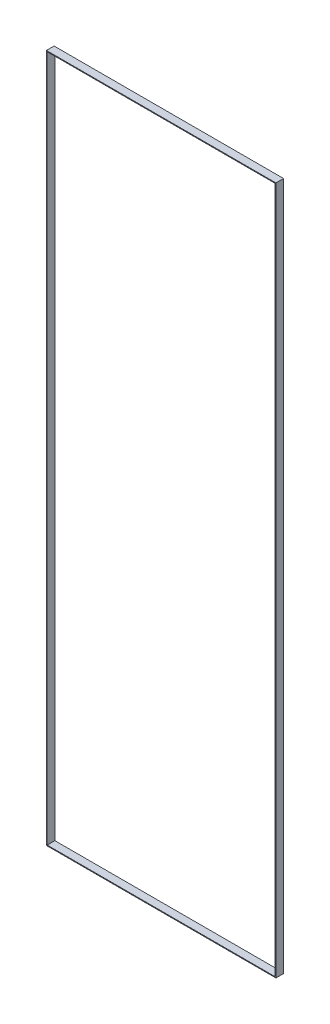
ISO-10303-21;
HEADER;
FILE_DESCRIPTION(('STEP AP214'),'2;1');
FILE_NAME('part.step','',(''),(''),'','','');
FILE_SCHEMA(('AUTOMOTIVE_DESIGN { 1 0 10303 214 1 1 1 1 }'));
ENDSEC;
DATA;
#1=APPLICATION_CONTEXT('core data for automotive mechanical design processes');
#2=APPLICATION_PROTOCOL_DEFINITION('international standard','automotive_design',2000,#1);
#3=PRODUCT_CONTEXT('',#1,'mechanical');
#4=PRODUCT('Part','Part','',(#3));
#5=PRODUCT_RELATED_PRODUCT_CATEGORY('part','',(#4));
#6=PRODUCT_DEFINITION_FORMATION('','',#4);
#7=PRODUCT_DEFINITION_CONTEXT('part definition',#1,'design');
#8=PRODUCT_DEFINITION('design','',#6,#7);
#9=PRODUCT_DEFINITION_SHAPE('','',#8);
#10=(LENGTH_UNIT() NAMED_UNIT(*) SI_UNIT(.MILLI.,.METRE.));
#11=(NAMED_UNIT(*) PLANE_ANGLE_UNIT() SI_UNIT($,.RADIAN.));
#12=(NAMED_UNIT(*) SI_UNIT($,.STERADIAN.) SOLID_ANGLE_UNIT());
#13=UNCERTAINTY_MEASURE_WITH_UNIT(LENGTH_MEASURE(1.E-05),#10,'distance_accuracy_value','');
#14=(GEOMETRIC_REPRESENTATION_CONTEXT(3) GLOBAL_UNCERTAINTY_ASSIGNED_CONTEXT((#13)) GLOBAL_UNIT_ASSIGNED_CONTEXT((#10,
#11,#12)) REPRESENTATION_CONTEXT('',''));
#15=CARTESIAN_POINT('',(0.,0.,0.));
#16=DIRECTION('',(0.,0.,1.));
#17=DIRECTION('',(1.,0.,0.));
#18=AXIS2_PLACEMENT_3D('',#15,#16,#17);
#19=CARTESIAN_POINT('',(0.,0.,20.));
#20=DIRECTION('',(0.,0.,1.));
#21=DIRECTION('',(1.,0.,0.));
#22=AXIS2_PLACEMENT_3D('',#19,#20,#21);
#23=PLANE('',#22);
#24=DIRECTION('',(0.,-1.,0.));
#25=VECTOR('',#24,1.);
#26=CARTESIAN_POINT('',(-300.,-900.,20.));
#27=LINE('',#26,#25);
#28=CARTESIAN_POINT('',(-300.,900.,20.));
#29=VERTEX_POINT('',#28);
#30=CARTESIAN_POINT('',(-300.,-900.,20.));
#31=VERTEX_POINT('',#30);
#32=EDGE_CURVE('E134',#29,#31,#27,.T.);
#33=ORIENTED_EDGE('',*,*,#32,.T.);
#34=DIRECTION('',(1.,0.,0.));
#35=VECTOR('',#34,1.);
#36=CARTESIAN_POINT('',(300.,-900.,20.));
#37=LINE('',#36,#35);
#38=CARTESIAN_POINT('',(300.,-900.,20.));
#39=VERTEX_POINT('',#38);
#40=EDGE_CURVE('E137',#31,#39,#37,.T.);
#41=ORIENTED_EDGE('',*,*,#40,.T.);
#42=DIRECTION('',(0.,1.,0.));
#43=VECTOR('',#42,1.);
#44=CARTESIAN_POINT('',(300.,-900.,20.));
#45=LINE('',#44,#43);
#46=CARTESIAN_POINT('',(300.,900.,20.));
#47=VERTEX_POINT('',#46);
#48=EDGE_CURVE('E140',#39,#47,#45,.T.);
#49=ORIENTED_EDGE('',*,*,#48,.T.);
#50=DIRECTION('',(-1.,0.,0.));
#51=VECTOR('',#50,1.);
#52=CARTESIAN_POINT('',(300.,900.,20.));
#53=LINE('',#52,#51);
#54=EDGE_CURVE('E142',#47,#29,#53,.T.);
#55=ORIENTED_EDGE('',*,*,#54,.T.);
#56=EDGE_LOOP('',(#33,#41,#49,#55));
#57=FACE_BOUND('',#56,.T.);
#58=DIRECTION('',(1.,0.,0.));
#59=VECTOR('',#58,1.);
#60=CARTESIAN_POINT('',(298.,-898.,20.));
#61=LINE('',#60,#59);
#62=CARTESIAN_POINT('',(-298.,-898.,20.));
#63=VERTEX_POINT('',#62);
#64=CARTESIAN_POINT('',(298.,-898.,20.));
#65=VERTEX_POINT('',#64);
#66=EDGE_CURVE('E106',#63,#65,#61,.T.);
#67=ORIENTED_EDGE('',*,*,#66,.F.);
#68=DIRECTION('',(0.,-1.,0.));
#69=VECTOR('',#68,1.);
#70=CARTESIAN_POINT('',(-298.,-898.,20.));
#71=LINE('',#70,#69);
#72=CARTESIAN_POINT('',(-298.,898.,20.));
#73=VERTEX_POINT('',#72);
#74=EDGE_CURVE('E98',#73,#63,#71,.T.);
#75=ORIENTED_EDGE('',*,*,#74,.F.);
#76=DIRECTION('',(-1.,0.,0.));
#77=VECTOR('',#76,1.);
#78=CARTESIAN_POINT('',(298.,898.,20.));
#79=LINE('',#78,#77);
#80=CARTESIAN_POINT('',(298.,898.,20.));
#81=VERTEX_POINT('',#80);
#82=EDGE_CURVE('E120',#81,#73,#79,.T.);
#83=ORIENTED_EDGE('',*,*,#82,.F.);
#84=DIRECTION('',(0.,1.,0.));
#85=VECTOR('',#84,1.);
#86=CARTESIAN_POINT('',(298.,-898.,20.));
#87=LINE('',#86,#85);
#88=EDGE_CURVE('E118',#65,#81,#87,.T.);
#89=ORIENTED_EDGE('',*,*,#88,.F.);
#90=EDGE_LOOP('',(#67,#75,#83,#89));
#91=FACE_BOUND('',#90,.T.);
#92=ADVANCED_FACE('F33',(#57,#91),#23,.T.);
#93=CARTESIAN_POINT('',(0.,0.,0.));
#94=DIRECTION('',(0.,0.,1.));
#95=DIRECTION('',(1.,0.,0.));
#96=AXIS2_PLACEMENT_3D('',#93,#94,#95);
#97=PLANE('',#96);
#98=DIRECTION('',(0.,-1.,0.));
#99=VECTOR('',#98,1.);
#100=CARTESIAN_POINT('',(-300.,-900.,0.));
#101=LINE('',#100,#99);
#102=CARTESIAN_POINT('',(-300.,900.,0.));
#103=VERTEX_POINT('',#102);
#104=CARTESIAN_POINT('',(-300.,-900.,0.));
#105=VERTEX_POINT('',#104);
#106=EDGE_CURVE('E114',#103,#105,#101,.T.);
#107=ORIENTED_EDGE('',*,*,#106,.F.);
#108=DIRECTION('',(-1.,0.,0.));
#109=VECTOR('',#108,1.);
#110=CARTESIAN_POINT('',(300.,900.,0.));
#111=LINE('',#110,#109);
#112=CARTESIAN_POINT('',(300.,900.,0.));
#113=VERTEX_POINT('',#112);
#114=EDGE_CURVE('E138',#113,#103,#111,.T.);
#115=ORIENTED_EDGE('',*,*,#114,.F.);
#116=DIRECTION('',(0.,1.,0.));
#117=VECTOR('',#116,1.);
#118=CARTESIAN_POINT('',(300.,-900.,0.));
#119=LINE('',#118,#117);
#120=CARTESIAN_POINT('',(300.,-900.,0.));
#121=VERTEX_POINT('',#120);
#122=EDGE_CURVE('E149',#121,#113,#119,.T.);
#123=ORIENTED_EDGE('',*,*,#122,.F.);
#124=DIRECTION('',(1.,0.,0.));
#125=VECTOR('',#124,1.);
#126=CARTESIAN_POINT('',(300.,-900.,0.));
#127=LINE('',#126,#125);
#128=EDGE_CURVE('E147',#105,#121,#127,.T.);
#129=ORIENTED_EDGE('',*,*,#128,.F.);
#130=EDGE_LOOP('',(#107,#115,#123,#129));
#131=FACE_BOUND('',#130,.T.);
#132=DIRECTION('',(0.,-1.,0.));
#133=VECTOR('',#132,1.);
#134=CARTESIAN_POINT('',(-298.,-898.,0.));
#135=LINE('',#134,#133);
#136=CARTESIAN_POINT('',(-298.,898.,0.));
#137=VERTEX_POINT('',#136);
#138=CARTESIAN_POINT('',(-298.,-898.,0.));
#139=VERTEX_POINT('',#138);
#140=EDGE_CURVE('E56',#137,#139,#135,.T.);
#141=ORIENTED_EDGE('',*,*,#140,.T.);
#142=DIRECTION('',(1.,0.,0.));
#143=VECTOR('',#142,1.);
#144=CARTESIAN_POINT('',(298.,-898.,0.));
#145=LINE('',#144,#143);
#146=CARTESIAN_POINT('',(298.,-898.,0.));
#147=VERTEX_POINT('',#146);
#148=EDGE_CURVE('E113',#139,#147,#145,.T.);
#149=ORIENTED_EDGE('',*,*,#148,.T.);
#150=DIRECTION('',(0.,1.,0.));
#151=VECTOR('',#150,1.);
#152=CARTESIAN_POINT('',(298.,-898.,0.));
#153=LINE('',#152,#151);
#154=CARTESIAN_POINT('',(298.,898.,0.));
#155=VERTEX_POINT('',#154);
#156=EDGE_CURVE('E126',#147,#155,#153,.T.);
#157=ORIENTED_EDGE('',*,*,#156,.T.);
#158=DIRECTION('',(-1.,0.,0.));
#159=VECTOR('',#158,1.);
#160=CARTESIAN_POINT('',(298.,898.,0.));
#161=LINE('',#160,#159);
#162=EDGE_CURVE('E107',#155,#137,#161,.T.);
#163=ORIENTED_EDGE('',*,*,#162,.T.);
#164=EDGE_LOOP('',(#141,#149,#157,#163));
#165=FACE_BOUND('',#164,.T.);
#166=ADVANCED_FACE('F167',(#131,#165),#97,.F.);
#167=CARTESIAN_POINT('',(-300.,-900.,20.));
#168=DIRECTION('',(1.,0.,0.));
#169=DIRECTION('',(0.,0.,-1.));
#170=AXIS2_PLACEMENT_3D('',#167,#168,#169);
#171=PLANE('',#170);
#172=ORIENTED_EDGE('',*,*,#106,.T.);
#173=DIRECTION('',(0.,0.,-1.));
#174=VECTOR('',#173,1.);
#175=CARTESIAN_POINT('',(-300.,-900.,20.));
#176=LINE('',#175,#174);
#177=EDGE_CURVE('E11',#31,#105,#176,.T.);
#178=ORIENTED_EDGE('',*,*,#177,.F.);
#179=ORIENTED_EDGE('',*,*,#32,.F.);
#180=DIRECTION('',(0.,0.,-1.));
#181=VECTOR('',#180,1.);
#182=CARTESIAN_POINT('',(-300.,900.,20.));
#183=LINE('',#182,#181);
#184=EDGE_CURVE('E144',#29,#103,#183,.T.);
#185=ORIENTED_EDGE('',*,*,#184,.T.);
#186=EDGE_LOOP('',(#172,#178,#179,#185));
#187=FACE_BOUND('',#186,.T.);
#188=ADVANCED_FACE('F35',(#187),#171,.F.);
#189=CARTESIAN_POINT('',(300.,-900.,20.));
#190=DIRECTION('',(0.,1.,0.));
#191=DIRECTION('',(0.,0.,1.));
#192=AXIS2_PLACEMENT_3D('',#189,#190,#191);
#193=PLANE('',#192);
#194=ORIENTED_EDGE('',*,*,#128,.T.);
#195=DIRECTION('',(0.,0.,-1.));
#196=VECTOR('',#195,1.);
#197=CARTESIAN_POINT('',(300.,-900.,20.));
#198=LINE('',#197,#196);
#199=EDGE_CURVE('E41',#39,#121,#198,.T.);
#200=ORIENTED_EDGE('',*,*,#199,.F.);
#201=ORIENTED_EDGE('',*,*,#40,.F.);
#202=ORIENTED_EDGE('',*,*,#177,.T.);
#203=EDGE_LOOP('',(#194,#200,#201,#202));
#204=FACE_BOUND('',#203,.T.);
#205=ADVANCED_FACE('F177',(#204),#193,.F.);
#206=CARTESIAN_POINT('',(300.,-900.,20.));
#207=DIRECTION('',(-1.,0.,0.));
#208=DIRECTION('',(0.,0.,1.));
#209=AXIS2_PLACEMENT_3D('',#206,#207,#208);
#210=PLANE('',#209);
#211=ORIENTED_EDGE('',*,*,#122,.T.);
#212=DIRECTION('',(0.,0.,-1.));
#213=VECTOR('',#212,1.);
#214=CARTESIAN_POINT('',(300.,900.,20.));
#215=LINE('',#214,#213);
#216=EDGE_CURVE('E154',#47,#113,#215,.T.);
#217=ORIENTED_EDGE('',*,*,#216,.F.);
#218=ORIENTED_EDGE('',*,*,#48,.F.);
#219=ORIENTED_EDGE('',*,*,#199,.T.);
#220=EDGE_LOOP('',(#211,#217,#218,#219));
#221=FACE_BOUND('',#220,.T.);
#222=ADVANCED_FACE('F161',(#221),#210,.F.);
#223=CARTESIAN_POINT('',(300.,900.,20.));
#224=DIRECTION('',(0.,-1.,0.));
#225=DIRECTION('',(0.,0.,-1.));
#226=AXIS2_PLACEMENT_3D('',#223,#224,#225);
#227=PLANE('',#226);
#228=ORIENTED_EDGE('',*,*,#114,.T.);
#229=ORIENTED_EDGE('',*,*,#184,.F.);
#230=ORIENTED_EDGE('',*,*,#54,.F.);
#231=ORIENTED_EDGE('',*,*,#216,.T.);
#232=EDGE_LOOP('',(#228,#229,#230,#231));
#233=FACE_BOUND('',#232,.T.);
#234=ADVANCED_FACE('F171',(#233),#227,.F.);
#235=CARTESIAN_POINT('',(-298.,-898.,20.));
#236=DIRECTION('',(1.,0.,0.));
#237=DIRECTION('',(0.,0.,-1.));
#238=AXIS2_PLACEMENT_3D('',#235,#236,#237);
#239=PLANE('',#238);
#240=ORIENTED_EDGE('',*,*,#140,.F.);
#241=DIRECTION('',(0.,0.,-1.));
#242=VECTOR('',#241,1.);
#243=CARTESIAN_POINT('',(-298.,898.,20.));
#244=LINE('',#243,#242);
#245=EDGE_CURVE('E102',#73,#137,#244,.T.);
#246=ORIENTED_EDGE('',*,*,#245,.F.);
#247=ORIENTED_EDGE('',*,*,#74,.T.);
#248=DIRECTION('',(0.,0.,-1.));
#249=VECTOR('',#248,1.);
#250=CARTESIAN_POINT('',(-298.,-898.,20.));
#251=LINE('',#250,#249);
#252=EDGE_CURVE('E101',#63,#139,#251,.T.);
#253=ORIENTED_EDGE('',*,*,#252,.T.);
#254=EDGE_LOOP('',(#240,#246,#247,#253));
#255=FACE_BOUND('',#254,.T.);
#256=ADVANCED_FACE('F100',(#255),#239,.T.);
#257=CARTESIAN_POINT('',(298.,-898.,20.));
#258=DIRECTION('',(0.,1.,0.));
#259=DIRECTION('',(0.,0.,1.));
#260=AXIS2_PLACEMENT_3D('',#257,#258,#259);
#261=PLANE('',#260);
#262=ORIENTED_EDGE('',*,*,#148,.F.);
#263=ORIENTED_EDGE('',*,*,#252,.F.);
#264=ORIENTED_EDGE('',*,*,#66,.T.);
#265=DIRECTION('',(0.,0.,-1.));
#266=VECTOR('',#265,1.);
#267=CARTESIAN_POINT('',(298.,-898.,20.));
#268=LINE('',#267,#266);
#269=EDGE_CURVE('E115',#65,#147,#268,.T.);
#270=ORIENTED_EDGE('',*,*,#269,.T.);
#271=EDGE_LOOP('',(#262,#263,#264,#270));
#272=FACE_BOUND('',#271,.T.);
#273=ADVANCED_FACE('F110',(#272),#261,.T.);
#274=CARTESIAN_POINT('',(298.,-898.,20.));
#275=DIRECTION('',(-1.,0.,0.));
#276=DIRECTION('',(0.,0.,1.));
#277=AXIS2_PLACEMENT_3D('',#274,#275,#276);
#278=PLANE('',#277);
#279=ORIENTED_EDGE('',*,*,#156,.F.);
#280=ORIENTED_EDGE('',*,*,#269,.F.);
#281=ORIENTED_EDGE('',*,*,#88,.T.);
#282=DIRECTION('',(0.,0.,-1.));
#283=VECTOR('',#282,1.);
#284=CARTESIAN_POINT('',(298.,898.,20.));
#285=LINE('',#284,#283);
#286=EDGE_CURVE('E48',#81,#155,#285,.T.);
#287=ORIENTED_EDGE('',*,*,#286,.T.);
#288=EDGE_LOOP('',(#279,#280,#281,#287));
#289=FACE_BOUND('',#288,.T.);
#290=ADVANCED_FACE('F200',(#289),#278,.T.);
#291=CARTESIAN_POINT('',(298.,898.,20.));
#292=DIRECTION('',(0.,-1.,0.));
#293=DIRECTION('',(1.,0.,0.));
#294=AXIS2_PLACEMENT_3D('',#291,#292,#293);
#295=PLANE('',#294);
#296=ORIENTED_EDGE('',*,*,#162,.F.);
#297=ORIENTED_EDGE('',*,*,#286,.F.);
#298=ORIENTED_EDGE('',*,*,#82,.T.);
#299=ORIENTED_EDGE('',*,*,#245,.T.);
#300=EDGE_LOOP('',(#296,#297,#298,#299));
#301=FACE_BOUND('',#300,.T.);
#302=ADVANCED_FACE('F204',(#301),#295,.T.);
#303=CLOSED_SHELL('',(#92,#166,#188,#205,#222,#234,#256,#273,#290,#302));
#304=MANIFOLD_SOLID_BREP('B2',#303);
#305=ADVANCED_BREP_SHAPE_REPRESENTATION('',(#18,#304),#14);
#306=SHAPE_DEFINITION_REPRESENTATION(#9,#305);
ENDSEC;
END-ISO-10303-21;
